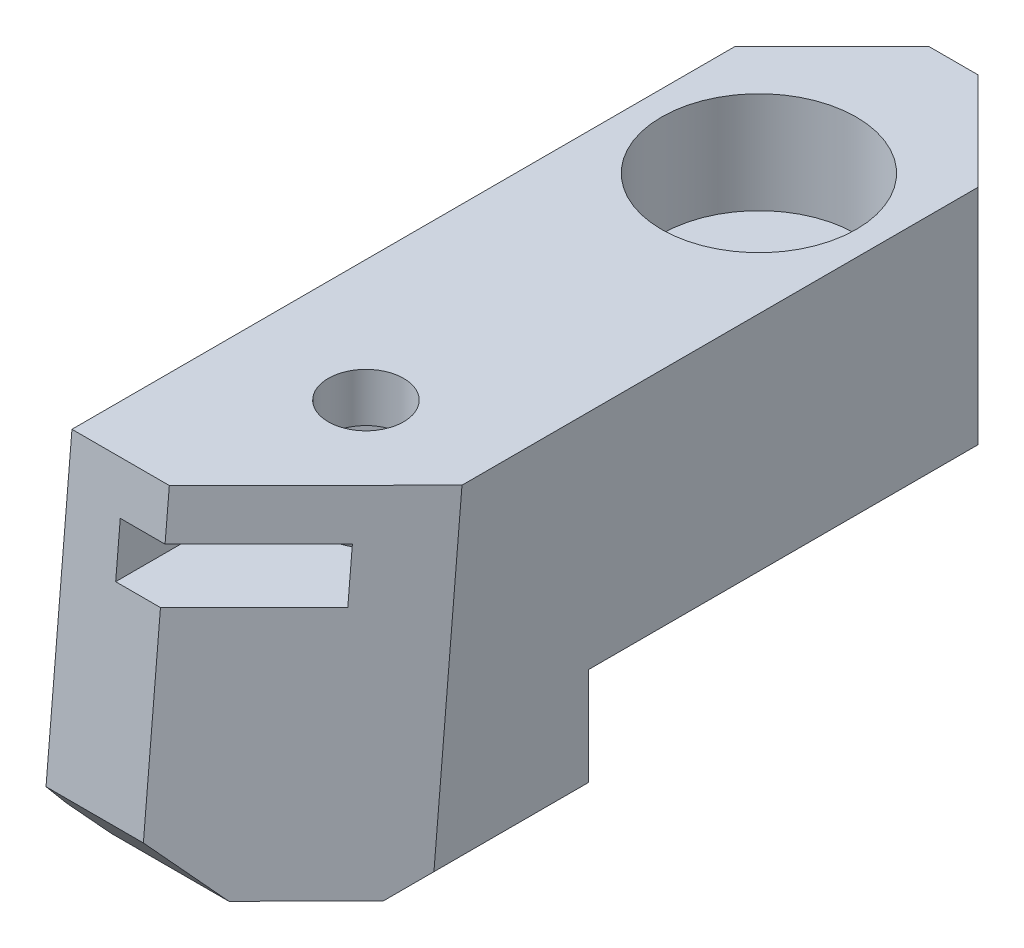
ISO-10303-21;
HEADER;
FILE_DESCRIPTION(('STEP AP214'),'2;1');
FILE_NAME('part.step','',(''),(''),'','','');
FILE_SCHEMA(('AUTOMOTIVE_DESIGN { 1 0 10303 214 1 1 1 1 }'));
ENDSEC;
DATA;
#1=APPLICATION_CONTEXT('core data for automotive mechanical design processes');
#2=APPLICATION_PROTOCOL_DEFINITION('international standard','automotive_design',2000,#1);
#3=PRODUCT_CONTEXT('',#1,'mechanical');
#4=PRODUCT('Part','Part','',(#3));
#5=PRODUCT_RELATED_PRODUCT_CATEGORY('part','',(#4));
#6=PRODUCT_DEFINITION_FORMATION('','',#4);
#7=PRODUCT_DEFINITION_CONTEXT('part definition',#1,'design');
#8=PRODUCT_DEFINITION('design','',#6,#7);
#9=PRODUCT_DEFINITION_SHAPE('','',#8);
#10=(LENGTH_UNIT() NAMED_UNIT(*) SI_UNIT(.MILLI.,.METRE.));
#11=(NAMED_UNIT(*) PLANE_ANGLE_UNIT() SI_UNIT($,.RADIAN.));
#12=(NAMED_UNIT(*) SI_UNIT($,.STERADIAN.) SOLID_ANGLE_UNIT());
#13=UNCERTAINTY_MEASURE_WITH_UNIT(LENGTH_MEASURE(1.E-05),#10,'distance_accuracy_value','');
#14=(GEOMETRIC_REPRESENTATION_CONTEXT(3) GLOBAL_UNCERTAINTY_ASSIGNED_CONTEXT((#13)) GLOBAL_UNIT_ASSIGNED_CONTEXT((#10,
#11,#12)) REPRESENTATION_CONTEXT('',''));
#15=CARTESIAN_POINT('',(0.,0.,0.));
#16=DIRECTION('',(0.,0.,1.));
#17=DIRECTION('',(1.,0.,0.));
#18=AXIS2_PLACEMENT_3D('',#15,#16,#17);
#19=CARTESIAN_POINT('',(7.9375,4.7625,-12.7));
#20=DIRECTION('',(0.,-1.,0.));
#21=DIRECTION('',(0.,0.,-1.));
#22=AXIS2_PLACEMENT_3D('',#19,#20,#21);
#23=PLANE('',#22);
#24=CARTESIAN_POINT('',(0.,4.7625,0.));
#25=DIRECTION('',(0.,-1.,0.));
#26=DIRECTION('',(0.,0.,-1.));
#27=AXIS2_PLACEMENT_3D('',#24,#25,#26);
#28=CIRCLE('',#27,2.45744999999999);
#29=CARTESIAN_POINT('',(0.,4.7625,-2.45744999999999));
#30=VERTEX_POINT('',#29);
#31=EDGE_CURVE('E269',#30,#30,#28,.T.);
#32=ORIENTED_EDGE('',*,*,#31,.T.);
#33=EDGE_LOOP('',(#32));
#34=FACE_BOUND('',#33,.T.);
#35=CARTESIAN_POINT('',(0.,4.7625,0.));
#36=DIRECTION('',(0.,1.,0.));
#37=DIRECTION('',(0.,0.,1.));
#38=AXIS2_PLACEMENT_3D('',#35,#36,#37);
#39=CIRCLE('',#38,6.35);
#40=CARTESIAN_POINT('',(0.,4.7625,6.35));
#41=VERTEX_POINT('',#40);
#42=EDGE_CURVE('E442',#41,#41,#39,.T.);
#43=ORIENTED_EDGE('',*,*,#42,.T.);
#44=EDGE_LOOP('',(#43));
#45=FACE_BOUND('',#44,.T.);
#46=ADVANCED_FACE('F35',(#34,#45),#23,.F.);
#47=CARTESIAN_POINT('',(0.,4.76249999999999,25.6261388396072));
#48=DIRECTION('',(0.,-1.,0.));
#49=DIRECTION('',(0.,0.,-1.));
#50=AXIS2_PLACEMENT_3D('',#47,#48,#49);
#51=CIRCLE('',#50,2.45744999999999);
#52=CARTESIAN_POINT('',(0.,4.76249999999999,23.1686888396072));
#53=VERTEX_POINT('',#52);
#54=EDGE_CURVE('E220',#53,#53,#51,.T.);
#55=ORIENTED_EDGE('',*,*,#54,.T.);
#56=EDGE_LOOP('',(#55));
#57=FACE_BOUND('',#56,.T.);
#58=DIRECTION('',(-1.,0.,0.));
#59=VECTOR('',#58,1.);
#60=CARTESIAN_POINT('',(7.9375,4.7625,37.4380337609568));
#61=LINE('',#60,#59);
#62=CARTESIAN_POINT('',(-1.58750000000001,4.7625,37.4380337609568));
#63=VERTEX_POINT('',#62);
#64=CARTESIAN_POINT('',(-4.5085,4.76250000000003,37.4380337609568));
#65=VERTEX_POINT('',#64);
#66=EDGE_CURVE('E219',#63,#65,#61,.T.);
#67=ORIENTED_EDGE('',*,*,#66,.F.);
#68=DIRECTION('',(-0.705757556807953,0.,0.708453436019947));
#69=VECTOR('',#68,1.);
#70=CARTESIAN_POINT('',(-1.58750000000001,4.7625,37.4380337609568));
#71=LINE('',#70,#69);
#72=CARTESIAN_POINT('',(4.5085,4.76249999999999,31.3187480312926));
#73=VERTEX_POINT('',#72);
#74=EDGE_CURVE('E390',#63,#73,#71,.F.);
#75=ORIENTED_EDGE('',*,*,#74,.T.);
#76=DIRECTION('',(0.,0.,1.));
#77=VECTOR('',#76,1.);
#78=CARTESIAN_POINT('',(4.5085,4.76249999999999,37.4380337609568));
#79=LINE('',#78,#77);
#80=CARTESIAN_POINT('',(4.5085,4.7625,23.0231551509658));
#81=VERTEX_POINT('',#80);
#82=EDGE_CURVE('E240',#81,#73,#79,.T.);
#83=ORIENTED_EDGE('',*,*,#82,.F.);
#84=DIRECTION('',(0.866025403784439,0.,0.5));
#85=VECTOR('',#84,1.);
#86=CARTESIAN_POINT('',(4.5085,4.7625,23.0231551509658));
#87=LINE('',#86,#85);
#88=CARTESIAN_POINT('',(0.,4.7625,20.4201714623243));
#89=VERTEX_POINT('',#88);
#90=EDGE_CURVE('E255',#89,#81,#87,.T.);
#91=ORIENTED_EDGE('',*,*,#90,.F.);
#92=DIRECTION('',(0.866025403784438,0.,-0.5));
#93=VECTOR('',#92,1.);
#94=CARTESIAN_POINT('',(0.,4.7625,20.4201714623243));
#95=LINE('',#94,#93);
#96=CARTESIAN_POINT('',(-4.5085,4.7625,23.0231551509658));
#97=VERTEX_POINT('',#96);
#98=EDGE_CURVE('E252',#97,#89,#95,.T.);
#99=ORIENTED_EDGE('',*,*,#98,.F.);
#100=DIRECTION('',(0.,0.,-1.));
#101=VECTOR('',#100,1.);
#102=CARTESIAN_POINT('',(-4.5085,4.7625,23.0231551509658));
#103=LINE('',#102,#101);
#104=EDGE_CURVE('E230',#65,#97,#103,.T.);
#105=ORIENTED_EDGE('',*,*,#104,.F.);
#106=EDGE_LOOP('',(#67,#75,#83,#91,#99,#105));
#107=FACE_BOUND('',#106,.T.);
#108=ADVANCED_FACE('F417',(#57,#107),#23,.F.);
#109=CARTESIAN_POINT('',(7.9375,-4.7625,-12.7));
#110=DIRECTION('',(0.,1.,0.));
#111=DIRECTION('',(0.,0.,1.));
#112=AXIS2_PLACEMENT_3D('',#109,#110,#111);
#113=PLANE('',#112);
#114=CARTESIAN_POINT('',(0.,-4.7625,0.));
#115=DIRECTION('',(0.,1.,0.));
#116=DIRECTION('',(0.,0.,1.));
#117=AXIS2_PLACEMENT_3D('',#114,#115,#116);
#118=CIRCLE('',#117,2.45744999999999);
#119=CARTESIAN_POINT('',(0.,-4.7625,2.45744999999999));
#120=VERTEX_POINT('',#119);
#121=EDGE_CURVE('E272',#120,#120,#118,.T.);
#122=ORIENTED_EDGE('',*,*,#121,.T.);
#123=EDGE_LOOP('',(#122));
#124=FACE_BOUND('',#123,.T.);
#125=DIRECTION('',(-0.707106781186549,0.,0.707106781186546));
#126=VECTOR('',#125,1.);
#127=CARTESIAN_POINT('',(15.875,-4.7625,-4.76249999999995));
#128=LINE('',#127,#126);
#129=CARTESIAN_POINT('',(-1.58749999999998,-4.7625,12.7));
#130=VERTEX_POINT('',#129);
#131=CARTESIAN_POINT('',(-6.35000000000001,-4.7625,17.4625));
#132=VERTEX_POINT('',#131);
#133=EDGE_CURVE('E307',#130,#132,#128,.T.);
#134=ORIENTED_EDGE('',*,*,#133,.T.);
#135=DIRECTION('',(0.,0.,-1.));
#136=VECTOR('',#135,1.);
#137=CARTESIAN_POINT('',(-6.35000000000001,-4.7625,-12.7));
#138=LINE('',#137,#136);
#139=CARTESIAN_POINT('',(-6.35000000000001,-4.7625,-5.6924359697327));
#140=VERTEX_POINT('',#139);
#141=EDGE_CURVE('E323',#132,#140,#138,.T.);
#142=ORIENTED_EDGE('',*,*,#141,.T.);
#143=DIRECTION('',(0.707106781186546,0.,-0.707106781186549));
#144=VECTOR('',#143,1.);
#145=CARTESIAN_POINT('',(-0.464967984866366,-4.7625,-11.5774679848664));
#146=LINE('',#145,#144);
#147=CARTESIAN_POINT('',(-0.92993596973272,-4.7625,-11.1125));
#148=VERTEX_POINT('',#147);
#149=EDGE_CURVE('E321',#140,#148,#146,.T.);
#150=ORIENTED_EDGE('',*,*,#149,.T.);
#151=DIRECTION('',(1.,0.,0.));
#152=VECTOR('',#151,1.);
#153=CARTESIAN_POINT('',(7.9375,-4.7625,-11.1125));
#154=LINE('',#153,#152);
#155=CARTESIAN_POINT('',(0.929935969732696,-4.7625,-11.1125));
#156=VERTEX_POINT('',#155);
#157=EDGE_CURVE('E319',#148,#156,#154,.T.);
#158=ORIENTED_EDGE('',*,*,#157,.T.);
#159=DIRECTION('',(0.707106781186549,0.,0.707106781186546));
#160=VECTOR('',#159,1.);
#161=CARTESIAN_POINT('',(6.81496798486636,-4.7625,-5.22746798486636));
#162=LINE('',#161,#160);
#163=CARTESIAN_POINT('',(6.35000000000001,-4.7625,-5.69243596973271));
#164=VERTEX_POINT('',#163);
#165=EDGE_CURVE('E317',#156,#164,#162,.T.);
#166=ORIENTED_EDGE('',*,*,#165,.T.);
#167=DIRECTION('',(0.,0.,1.));
#168=VECTOR('',#167,1.);
#169=CARTESIAN_POINT('',(6.35000000000001,-4.7625,19.05));
#170=LINE('',#169,#168);
#171=CARTESIAN_POINT('',(6.35000000000001,-4.7625,17.4625));
#172=VERTEX_POINT('',#171);
#173=EDGE_CURVE('E315',#164,#172,#170,.T.);
#174=ORIENTED_EDGE('',*,*,#173,.T.);
#175=DIRECTION('',(0.707106781186546,0.,0.707106781186549));
#176=VECTOR('',#175,1.);
#177=CARTESIAN_POINT('',(-7.93750000000001,-4.7625,3.17499999999996));
#178=LINE('',#177,#176);
#179=CARTESIAN_POINT('',(1.58750000000001,-4.7625,12.7));
#180=VERTEX_POINT('',#179);
#181=EDGE_CURVE('E305',#172,#180,#178,.F.);
#182=ORIENTED_EDGE('',*,*,#181,.T.);
#183=DIRECTION('',(-1.,0.,0.));
#184=VECTOR('',#183,1.);
#185=CARTESIAN_POINT('',(7.9375,-4.7625,12.7));
#186=LINE('',#185,#184);
#187=EDGE_CURVE('E282',#180,#130,#186,.T.);
#188=ORIENTED_EDGE('',*,*,#187,.T.);
#189=EDGE_LOOP('',(#134,#142,#150,#158,#166,#174,#182,#188));
#190=FACE_BOUND('',#189,.T.);
#191=ADVANCED_FACE('F468',(#124,#190),#113,.F.);
#192=CARTESIAN_POINT('',(7.9375,-4.7625,-12.7));
#193=DIRECTION('',(0.,0.,1.));
#194=DIRECTION('',(1.,0.,0.));
#195=AXIS2_PLACEMENT_3D('',#192,#193,#194);
#196=PLANE('',#195);
#197=DIRECTION('',(0.,-1.,0.));
#198=VECTOR('',#197,1.);
#199=CARTESIAN_POINT('',(1.58749999999998,-4.7625,-12.7));
#200=LINE('',#199,#198);
#201=CARTESIAN_POINT('',(1.58749999999998,11.3665,-12.7));
#202=VERTEX_POINT('',#201);
#203=CARTESIAN_POINT('',(1.58749999999998,-3.17500000000001,-12.7));
#204=VERTEX_POINT('',#203);
#205=EDGE_CURVE('E297',#202,#204,#200,.T.);
#206=ORIENTED_EDGE('',*,*,#205,.T.);
#207=DIRECTION('',(-1.,0.,0.));
#208=VECTOR('',#207,1.);
#209=CARTESIAN_POINT('',(7.9375,-3.17500000000001,-12.7));
#210=LINE('',#209,#208);
#211=CARTESIAN_POINT('',(-1.58750000000001,-3.17500000000001,-12.7));
#212=VERTEX_POINT('',#211);
#213=EDGE_CURVE('E333',#204,#212,#210,.T.);
#214=ORIENTED_EDGE('',*,*,#213,.T.);
#215=DIRECTION('',(0.,1.,0.));
#216=VECTOR('',#215,1.);
#217=CARTESIAN_POINT('',(-1.58750000000001,-4.7625,-12.7));
#218=LINE('',#217,#216);
#219=CARTESIAN_POINT('',(-1.58750000000001,11.3665,-12.7));
#220=VERTEX_POINT('',#219);
#221=EDGE_CURVE('E295',#212,#220,#218,.T.);
#222=ORIENTED_EDGE('',*,*,#221,.T.);
#223=DIRECTION('',(-1.,0.,0.));
#224=VECTOR('',#223,1.);
#225=CARTESIAN_POINT('',(1.58749999999998,11.3665,-12.7));
#226=LINE('',#225,#224);
#227=EDGE_CURVE('E437',#202,#220,#226,.T.);
#228=ORIENTED_EDGE('',*,*,#227,.F.);
#229=EDGE_LOOP('',(#206,#214,#222,#228));
#230=FACE_BOUND('',#229,.T.);
#231=ADVANCED_FACE('F473',(#230),#196,.F.);
#232=CARTESIAN_POINT('',(7.9375,0.,0.));
#233=DIRECTION('',(1.,0.,0.));
#234=DIRECTION('',(0.,0.,-1.));
#235=AXIS2_PLACEMENT_3D('',#232,#233,#234);
#236=PLANE('',#235);
#237=DIRECTION('',(0.,0.,-1.));
#238=VECTOR('',#237,1.);
#239=CARTESIAN_POINT('',(7.9375,11.3665,16.9911714623244));
#240=LINE('',#239,#238);
#241=CARTESIAN_POINT('',(7.9375,11.3665,27.2988746744316));
#242=VERTEX_POINT('',#241);
#243=CARTESIAN_POINT('',(7.9375,11.3665,-6.35));
#244=VERTEX_POINT('',#243);
#245=EDGE_CURVE('E227',#242,#244,#240,.T.);
#246=ORIENTED_EDGE('',*,*,#245,.F.);
#247=DIRECTION('',(0.,-0.996194698091751,0.0871557427476012));
#248=VECTOR('',#247,1.);
#249=CARTESIAN_POINT('',(7.9375,2.4565412574782,28.0783950568855));
#250=LINE('',#249,#248);
#251=CARTESIAN_POINT('',(7.9375,-9.5487844301668,29.1287249564903));
#252=VERTEX_POINT('',#251);
#253=EDGE_CURVE('E398',#242,#252,#250,.T.);
#254=ORIENTED_EDGE('',*,*,#253,.T.);
#255=DIRECTION('',(0.,0.,-1.));
#256=VECTOR('',#255,1.);
#257=CARTESIAN_POINT('',(7.9375,-9.54878443016482,-6.47897790496993E-13));
#258=LINE('',#257,#256);
#259=CARTESIAN_POINT('',(7.9375,-9.54878443016619,19.05));
#260=VERTEX_POINT('',#259);
#261=EDGE_CURVE('E337',#252,#260,#258,.T.);
#262=ORIENTED_EDGE('',*,*,#261,.T.);
#263=DIRECTION('',(0.,1.,0.));
#264=VECTOR('',#263,1.);
#265=CARTESIAN_POINT('',(7.9375,0.,19.05));
#266=LINE('',#265,#264);
#267=CARTESIAN_POINT('',(7.9375,-3.17500000000001,19.05));
#268=VERTEX_POINT('',#267);
#269=EDGE_CURVE('E293',#260,#268,#266,.T.);
#270=ORIENTED_EDGE('',*,*,#269,.T.);
#271=DIRECTION('',(0.,0.,-1.));
#272=VECTOR('',#271,1.);
#273=CARTESIAN_POINT('',(7.9375,-3.17500000000001,-6.35));
#274=LINE('',#273,#272);
#275=CARTESIAN_POINT('',(7.9375,-3.17500000000001,-6.35));
#276=VERTEX_POINT('',#275);
#277=EDGE_CURVE('E339',#268,#276,#274,.T.);
#278=ORIENTED_EDGE('',*,*,#277,.T.);
#279=DIRECTION('',(0.,1.,0.));
#280=VECTOR('',#279,1.);
#281=CARTESIAN_POINT('',(7.9375,4.7625,-6.35));
#282=LINE('',#281,#280);
#283=EDGE_CURVE('E290',#276,#244,#282,.T.);
#284=ORIENTED_EDGE('',*,*,#283,.T.);
#285=EDGE_LOOP('',(#246,#254,#262,#270,#278,#284));
#286=FACE_BOUND('',#285,.T.);
#287=ADVANCED_FACE('F403',(#286),#236,.T.);
#288=CARTESIAN_POINT('',(-7.9375,0.,0.));
#289=DIRECTION('',(1.,0.,0.));
#290=DIRECTION('',(0.,0.,-1.));
#291=AXIS2_PLACEMENT_3D('',#288,#289,#290);
#292=PLANE('',#291);
#293=DIRECTION('',(0.,0.996194698091751,-0.0871557427476012));
#294=VECTOR('',#293,1.);
#295=CARTESIAN_POINT('',(-7.9375,4.7625,37.4380337609568));
#296=LINE('',#295,#294);
#297=CARTESIAN_POINT('',(-7.9375,-7.97336626372615,38.5522776792144));
#298=VERTEX_POINT('',#297);
#299=CARTESIAN_POINT('',(-7.9375,11.3665,36.860258627032));
#300=VERTEX_POINT('',#299);
#301=EDGE_CURVE('E201',#298,#300,#296,.T.);
#302=ORIENTED_EDGE('',*,*,#301,.T.);
#303=DIRECTION('',(0.,0.,1.));
#304=VECTOR('',#303,1.);
#305=CARTESIAN_POINT('',(-7.9375,11.3665,16.9911714623244));
#306=LINE('',#305,#304);
#307=CARTESIAN_POINT('',(-7.9375,11.3665,-6.34999999999999));
#308=VERTEX_POINT('',#307);
#309=EDGE_CURVE('E215',#308,#300,#306,.T.);
#310=ORIENTED_EDGE('',*,*,#309,.F.);
#311=DIRECTION('',(0.,-1.,0.));
#312=VECTOR('',#311,1.);
#313=CARTESIAN_POINT('',(-7.9375,0.,-6.34999999999999));
#314=LINE('',#313,#312);
#315=CARTESIAN_POINT('',(-7.9375,-3.17500000000001,-6.34999999999999));
#316=VERTEX_POINT('',#315);
#317=EDGE_CURVE('E303',#308,#316,#314,.T.);
#318=ORIENTED_EDGE('',*,*,#317,.T.);
#319=DIRECTION('',(0.,0.,1.));
#320=VECTOR('',#319,1.);
#321=CARTESIAN_POINT('',(-7.9375,-3.17500000000001,0.));
#322=LINE('',#321,#320);
#323=CARTESIAN_POINT('',(-7.9375,-3.17500000000001,19.05));
#324=VERTEX_POINT('',#323);
#325=EDGE_CURVE('E328',#316,#324,#322,.T.);
#326=ORIENTED_EDGE('',*,*,#325,.T.);
#327=DIRECTION('',(0.,-1.,0.));
#328=VECTOR('',#327,1.);
#329=CARTESIAN_POINT('',(-7.9375,-11.1362844301657,19.05));
#330=LINE('',#329,#328);
#331=CARTESIAN_POINT('',(-7.9375,-9.54878443016611,19.05));
#332=VERTEX_POINT('',#331);
#333=EDGE_CURVE('E300',#324,#332,#330,.T.);
#334=ORIENTED_EDGE('',*,*,#333,.T.);
#335=DIRECTION('',(0.,0.,1.));
#336=VECTOR('',#335,1.);
#337=CARTESIAN_POINT('',(-7.9375,-9.54878443016726,35.8982742123096));
#338=LINE('',#337,#336);
#339=CARTESIAN_POINT('',(-7.9375,-9.54878443016735,37.2303448768035));
#340=VERTEX_POINT('',#339);
#341=EDGE_CURVE('E326',#332,#340,#338,.T.);
#342=ORIENTED_EDGE('',*,*,#341,.T.);
#343=DIRECTION('',(0.,-0.766044443118942,-0.642787609686583));
#344=VECTOR('',#343,1.);
#345=CARTESIAN_POINT('',(-7.9375,-11.1362844301673,35.8982742123094));
#346=LINE('',#345,#344);
#347=EDGE_CURVE('E218',#340,#298,#346,.F.);
#348=ORIENTED_EDGE('',*,*,#347,.T.);
#349=EDGE_LOOP('',(#302,#310,#318,#326,#334,#342,#348));
#350=FACE_BOUND('',#349,.T.);
#351=ADVANCED_FACE('F213',(#350),#292,.F.);
#352=CARTESIAN_POINT('',(7.9375,-11.1362844301657,12.7));
#353=DIRECTION('',(0.,0.,-1.));
#354=DIRECTION('',(-1.,0.,0.));
#355=AXIS2_PLACEMENT_3D('',#352,#353,#354);
#356=PLANE('',#355);
#357=DIRECTION('',(0.,-1.,0.));
#358=VECTOR('',#357,1.);
#359=CARTESIAN_POINT('',(1.58750000000001,-11.1362844301657,12.7));
#360=LINE('',#359,#358);
#361=CARTESIAN_POINT('',(1.58750000000001,-9.54878443016579,12.7));
#362=VERTEX_POINT('',#361);
#363=EDGE_CURVE('E287',#180,#362,#360,.T.);
#364=ORIENTED_EDGE('',*,*,#363,.T.);
#365=DIRECTION('',(-1.,0.,0.));
#366=VECTOR('',#365,1.);
#367=CARTESIAN_POINT('',(7.9375,-9.54878443016579,12.7));
#368=LINE('',#367,#366);
#369=CARTESIAN_POINT('',(-1.58749999999999,-9.54878443016576,12.7));
#370=VERTEX_POINT('',#369);
#371=EDGE_CURVE('E356',#362,#370,#368,.T.);
#372=ORIENTED_EDGE('',*,*,#371,.T.);
#373=DIRECTION('',(0.,1.,0.));
#374=VECTOR('',#373,1.);
#375=CARTESIAN_POINT('',(-1.58749999999999,-4.7625,12.7));
#376=LINE('',#375,#374);
#377=EDGE_CURVE('E285',#370,#130,#376,.T.);
#378=ORIENTED_EDGE('',*,*,#377,.T.);
#379=ORIENTED_EDGE('',*,*,#187,.F.);
#380=EDGE_LOOP('',(#364,#372,#378,#379));
#381=FACE_BOUND('',#380,.T.);
#382=ADVANCED_FACE('F555',(#381),#356,.T.);
#383=CARTESIAN_POINT('',(7.9375,4.7625,37.4380337609568));
#384=DIRECTION('',(0.,0.0871557427476012,0.996194698091751));
#385=DIRECTION('',(0.,-0.996194698091751,0.0871557427476012));
#386=AXIS2_PLACEMENT_3D('',#383,#384,#385);
#387=PLANE('',#386);
#388=DIRECTION('',(1.,0.,0.));
#389=VECTOR('',#388,1.);
#390=CARTESIAN_POINT('',(7.9375,-7.97336626372614,38.5522776792144));
#391=LINE('',#390,#389);
#392=CARTESIAN_POINT('',(-1.58750000000001,-7.97336626372614,38.5522776792144));
#393=VERTEX_POINT('',#392);
#394=EDGE_CURVE('E313',#298,#393,#391,.T.);
#395=ORIENTED_EDGE('',*,*,#394,.T.);
#396=DIRECTION('',(0.,0.996194698091751,-0.0871557427476012));
#397=VECTOR('',#396,1.);
#398=CARTESIAN_POINT('',(-1.58750000000001,4.7625,37.4380337609568));
#399=LINE('',#398,#397);
#400=EDGE_CURVE('E387',#393,#63,#399,.T.);
#401=ORIENTED_EDGE('',*,*,#400,.T.);
#402=ORIENTED_EDGE('',*,*,#66,.T.);
#403=DIRECTION('',(0.,-0.996194698091751,0.0871557427476022));
#404=VECTOR('',#403,1.);
#405=CARTESIAN_POINT('',(-4.5085,9.41701159349614,37.0308167622762));
#406=LINE('',#405,#404);
#407=CARTESIAN_POINT('',(-4.5085,8.19149999999999,37.1380351337266));
#408=VERTEX_POINT('',#407);
#409=EDGE_CURVE('E423',#408,#65,#406,.T.);
#410=ORIENTED_EDGE('',*,*,#409,.F.);
#411=DIRECTION('',(-1.,0.,0.));
#412=VECTOR('',#411,1.);
#413=CARTESIAN_POINT('',(0.,8.19149999999999,37.1380351337266));
#414=LINE('',#413,#412);
#415=CARTESIAN_POINT('',(-1.58750000000001,8.19149999999999,37.1380351337266));
#416=VERTEX_POINT('',#415);
#417=EDGE_CURVE('E209',#416,#408,#414,.T.);
#418=ORIENTED_EDGE('',*,*,#417,.F.);
#419=DIRECTION('',(0.,0.996194698091751,-0.0871557427476012));
#420=VECTOR('',#419,1.);
#421=CARTESIAN_POINT('',(-1.58750000000001,4.7625,37.4380337609568));
#422=LINE('',#421,#420);
#423=CARTESIAN_POINT('',(-1.58750000000001,11.3665,36.860258627032));
#424=VERTEX_POINT('',#423);
#425=EDGE_CURVE('E205',#416,#424,#422,.T.);
#426=ORIENTED_EDGE('',*,*,#425,.T.);
#427=DIRECTION('',(-1.,0.,0.));
#428=VECTOR('',#427,1.);
#429=CARTESIAN_POINT('',(7.9375,11.3665,36.860258627032));
#430=LINE('',#429,#428);
#431=EDGE_CURVE('E197',#424,#300,#430,.T.);
#432=ORIENTED_EDGE('',*,*,#431,.T.);
#433=ORIENTED_EDGE('',*,*,#301,.F.);
#434=EDGE_LOOP('',(#395,#401,#402,#410,#418,#426,#432,#433));
#435=FACE_BOUND('',#434,.T.);
#436=ADVANCED_FACE('F200',(#435),#387,.T.);
#437=CARTESIAN_POINT('',(7.9375,-11.1362844301675,38.828997162438));
#438=DIRECTION('',(0.,-1.,0.));
#439=DIRECTION('',(0.,0.,-1.));
#440=AXIS2_PLACEMENT_3D('',#437,#438,#439);
#441=PLANE('',#440);
#442=CARTESIAN_POINT('',(0.,-11.1362844301648,25.6261388396072));
#443=DIRECTION('',(0.,-1.,0.));
#444=DIRECTION('',(0.,0.,-1.));
#445=AXIS2_PLACEMENT_3D('',#442,#443,#444);
#446=CIRCLE('',#445,2.45744999999999);
#447=CARTESIAN_POINT('',(0.,-11.1362844301648,23.1686888396072));
#448=VERTEX_POINT('',#447);
#449=EDGE_CURVE('E276',#448,#448,#446,.T.);
#450=ORIENTED_EDGE('',*,*,#449,.F.);
#451=EDGE_LOOP('',(#450));
#452=FACE_BOUND('',#451,.T.);
#453=DIRECTION('',(0.,0.,1.));
#454=VECTOR('',#453,1.);
#455=CARTESIAN_POINT('',(6.35,-11.1362844301675,38.828997162438));
#456=LINE('',#455,#454);
#457=CARTESIAN_POINT('',(6.35,-11.1362844301662,19.7075640302672));
#458=VERTEX_POINT('',#457);
#459=CARTESIAN_POINT('',(6.35,-11.1362844301669,30.8611772019377));
#460=VERTEX_POINT('',#459);
#461=EDGE_CURVE('E349',#458,#460,#456,.T.);
#462=ORIENTED_EDGE('',*,*,#461,.T.);
#463=DIRECTION('',(0.70575755680795,0.,-0.708453436019949));
#464=VECTOR('',#463,1.);
#465=CARTESIAN_POINT('',(3.15684276864429,-11.1362844301671,34.0665317751675));
#466=LINE('',#465,#464);
#467=CARTESIAN_POINT('',(1.33207066449388,-11.1362844301673,35.8982742123094));
#468=VERTEX_POINT('',#467);
#469=EDGE_CURVE('E44',#460,#468,#466,.F.);
#470=ORIENTED_EDGE('',*,*,#469,.T.);
#471=DIRECTION('',(-1.,0.,0.));
#472=VECTOR('',#471,1.);
#473=CARTESIAN_POINT('',(7.9375,-11.1362844301673,35.8982742123094));
#474=LINE('',#473,#472);
#475=CARTESIAN_POINT('',(-6.35,-11.1362844301673,35.8982742123094));
#476=VERTEX_POINT('',#475);
#477=EDGE_CURVE('E310',#468,#476,#474,.T.);
#478=ORIENTED_EDGE('',*,*,#477,.T.);
#479=DIRECTION('',(0.,0.,-1.));
#480=VECTOR('',#479,1.);
#481=CARTESIAN_POINT('',(-6.35,-11.1362844301661,19.05));
#482=LINE('',#481,#480);
#483=CARTESIAN_POINT('',(-6.35,-11.1362844301662,19.7075640302672));
#484=VERTEX_POINT('',#483);
#485=EDGE_CURVE('E341',#476,#484,#482,.T.);
#486=ORIENTED_EDGE('',*,*,#485,.T.);
#487=DIRECTION('',(0.707106781186549,0.,-0.707106781186546));
#488=VECTOR('',#487,1.);
#489=CARTESIAN_POINT('',(-8.76696656608541,-11.1362844301663,22.1245305963526));
#490=LINE('',#489,#488);
#491=CARTESIAN_POINT('',(-0.929935969732704,-11.1362844301658,14.2874999999999));
#492=VERTEX_POINT('',#491);
#493=EDGE_CURVE('E343',#484,#492,#490,.T.);
#494=ORIENTED_EDGE('',*,*,#493,.T.);
#495=DIRECTION('',(1.,0.,0.));
#496=VECTOR('',#495,1.);
#497=CARTESIAN_POINT('',(7.9375,-11.1362844301658,14.2874999999999));
#498=LINE('',#497,#496);
#499=CARTESIAN_POINT('',(0.929935969732715,-11.1362844301658,14.2874999999999));
#500=VERTEX_POINT('',#499);
#501=EDGE_CURVE('E345',#492,#500,#498,.T.);
#502=ORIENTED_EDGE('',*,*,#501,.T.);
#503=DIRECTION('',(0.707106781186546,0.,0.707106781186549));
#504=VECTOR('',#503,1.);
#505=CARTESIAN_POINT('',(16.7044665660854,-11.1362844301669,30.0620305963526));
#506=LINE('',#505,#504);
#507=EDGE_CURVE('E347',#500,#458,#506,.T.);
#508=ORIENTED_EDGE('',*,*,#507,.T.);
#509=EDGE_LOOP('',(#462,#470,#478,#486,#494,#502,#508));
#510=FACE_BOUND('',#509,.T.);
#511=ADVANCED_FACE('F484',(#452,#510),#441,.T.);
#512=CARTESIAN_POINT('',(1.58750000000001,-11.1362844301657,12.7));
#513=DIRECTION('',(-0.707106781186549,0.,0.707106781186546));
#514=DIRECTION('',(0.,-1.,0.));
#515=AXIS2_PLACEMENT_3D('',#512,#513,#514);
#516=PLANE('',#515);
#517=ORIENTED_EDGE('',*,*,#269,.F.);
#518=DIRECTION('',(0.707106781186546,0.,0.707106781186549));
#519=VECTOR('',#518,1.);
#520=CARTESIAN_POINT('',(1.58750000000006,-9.54878443016576,12.7000000000001));
#521=LINE('',#520,#519);
#522=EDGE_CURVE('E354',#260,#362,#521,.F.);
#523=ORIENTED_EDGE('',*,*,#522,.T.);
#524=ORIENTED_EDGE('',*,*,#363,.F.);
#525=ORIENTED_EDGE('',*,*,#181,.F.);
#526=DIRECTION('',(-0.577350269189625,-0.577350269189625,-0.577350269189627));
#527=VECTOR('',#526,1.);
#528=CARTESIAN_POINT('',(1.58749999999999,-9.52500000000002,12.7));
#529=LINE('',#528,#527);
#530=EDGE_CURVE('E362',#172,#268,#529,.F.);
#531=ORIENTED_EDGE('',*,*,#530,.T.);
#532=EDGE_LOOP('',(#517,#523,#524,#525,#531));
#533=FACE_BOUND('',#532,.T.);
#534=ADVANCED_FACE('F480',(#533),#516,.F.);
#535=CARTESIAN_POINT('',(7.9375,0.,-6.35));
#536=DIRECTION('',(0.707106781186546,0.,-0.707106781186549));
#537=DIRECTION('',(0.,-1.,0.));
#538=AXIS2_PLACEMENT_3D('',#535,#536,#537);
#539=PLANE('',#538);
#540=ORIENTED_EDGE('',*,*,#283,.F.);
#541=DIRECTION('',(-0.707106781186549,0.,-0.707106781186546));
#542=VECTOR('',#541,1.);
#543=CARTESIAN_POINT('',(1.58749999999998,-3.17500000000001,-12.7));
#544=LINE('',#543,#542);
#545=EDGE_CURVE('E335',#276,#204,#544,.T.);
#546=ORIENTED_EDGE('',*,*,#545,.T.);
#547=ORIENTED_EDGE('',*,*,#205,.F.);
#548=DIRECTION('',(-0.707106781186549,0.,-0.707106781186546));
#549=VECTOR('',#548,1.);
#550=CARTESIAN_POINT('',(7.9375,11.3665,-6.35));
#551=LINE('',#550,#549);
#552=EDGE_CURVE('E439',#244,#202,#551,.T.);
#553=ORIENTED_EDGE('',*,*,#552,.F.);
#554=EDGE_LOOP('',(#540,#546,#547,#553));
#555=FACE_BOUND('',#554,.T.);
#556=ADVANCED_FACE('F483',(#555),#539,.T.);
#557=CARTESIAN_POINT('',(-1.58750000000001,-4.7625,-12.7));
#558=DIRECTION('',(0.707106781186549,0.,0.707106781186546));
#559=DIRECTION('',(0.,1.,0.));
#560=AXIS2_PLACEMENT_3D('',#557,#558,#559);
#561=PLANE('',#560);
#562=ORIENTED_EDGE('',*,*,#221,.F.);
#563=DIRECTION('',(0.707106781186546,0.,-0.707106781186549));
#564=VECTOR('',#563,1.);
#565=CARTESIAN_POINT('',(-7.9375,-3.17500000000001,-6.34999999999999));
#566=LINE('',#565,#564);
#567=EDGE_CURVE('E331',#212,#316,#566,.F.);
#568=ORIENTED_EDGE('',*,*,#567,.T.);
#569=ORIENTED_EDGE('',*,*,#317,.F.);
#570=DIRECTION('',(-0.707106781186546,0.,0.707106781186549));
#571=VECTOR('',#570,1.);
#572=CARTESIAN_POINT('',(-1.58750000000001,11.3665,-12.7));
#573=LINE('',#572,#571);
#574=EDGE_CURVE('E226',#220,#308,#573,.T.);
#575=ORIENTED_EDGE('',*,*,#574,.F.);
#576=EDGE_LOOP('',(#562,#568,#569,#575));
#577=FACE_BOUND('',#576,.T.);
#578=ADVANCED_FACE('F488',(#577),#561,.F.);
#579=CARTESIAN_POINT('',(-7.9375,0.,19.05));
#580=DIRECTION('',(-0.707106781186546,0.,-0.707106781186549));
#581=DIRECTION('',(0.,1.,0.));
#582=AXIS2_PLACEMENT_3D('',#579,#580,#581);
#583=PLANE('',#582);
#584=ORIENTED_EDGE('',*,*,#377,.F.);
#585=DIRECTION('',(-0.707106781186549,0.,0.707106781186546));
#586=VECTOR('',#585,1.);
#587=CARTESIAN_POINT('',(-7.93749999999968,-9.54878443016619,19.0499999999997));
#588=LINE('',#587,#586);
#589=EDGE_CURVE('E358',#370,#332,#588,.T.);
#590=ORIENTED_EDGE('',*,*,#589,.T.);
#591=ORIENTED_EDGE('',*,*,#333,.F.);
#592=DIRECTION('',(-0.577350269189627,0.577350269189626,0.577350269189624));
#593=VECTOR('',#592,1.);
#594=CARTESIAN_POINT('',(3.70416666666665,-14.8166666666667,7.40833333333339));
#595=LINE('',#594,#593);
#596=EDGE_CURVE('E360',#324,#132,#595,.F.);
#597=ORIENTED_EDGE('',*,*,#596,.T.);
#598=ORIENTED_EDGE('',*,*,#133,.F.);
#599=EDGE_LOOP('',(#584,#590,#591,#597,#598));
#600=FACE_BOUND('',#599,.T.);
#601=ADVANCED_FACE('F492',(#600),#583,.T.);
#602=CARTESIAN_POINT('',(7.9375,-11.1362844301673,35.8982742123094));
#603=DIRECTION('',(0.,0.642787609686583,-0.766044443118942));
#604=DIRECTION('',(-1.,0.,0.));
#605=AXIS2_PLACEMENT_3D('',#602,#603,#604);
#606=PLANE('',#605);
#607=ORIENTED_EDGE('',*,*,#477,.F.);
#608=DIRECTION('',(-0.577350269189624,0.625472668645301,0.524833885571801));
#609=VECTOR('',#608,1.);
#610=CARTESIAN_POINT('',(3.53388044299591,-13.5216160243518,33.8967433513934));
#611=LINE('',#610,#609);
#612=EDGE_CURVE('E11',#468,#393,#611,.T.);
#613=ORIENTED_EDGE('',*,*,#612,.T.);
#614=ORIENTED_EDGE('',*,*,#394,.F.);
#615=ORIENTED_EDGE('',*,*,#347,.F.);
#616=DIRECTION('',(-0.608120402411346,0.608120402411312,0.51027360537477));
#617=VECTOR('',#616,1.);
#618=CARTESIAN_POINT('',(-1.06633356954405,-16.4199508606229,31.4647516592498));
#619=LINE('',#618,#617);
#620=EDGE_CURVE('E351',#340,#476,#619,.F.);
#621=ORIENTED_EDGE('',*,*,#620,.T.);
#622=EDGE_LOOP('',(#607,#613,#614,#615,#621));
#623=FACE_BOUND('',#622,.T.);
#624=ADVANCED_FACE('F411',(#623),#606,.F.);
#625=CARTESIAN_POINT('',(0.,-11.1362844301648,25.6261388396072));
#626=DIRECTION('',(0.,-1.,0.));
#627=DIRECTION('',(0.,0.,-1.));
#628=AXIS2_PLACEMENT_3D('',#625,#626,#627);
#629=CYLINDRICAL_SURFACE('',#628,2.45744999999999);
#630=ORIENTED_EDGE('',*,*,#54,.F.);
#631=EDGE_LOOP('',(#630));
#632=FACE_BOUND('',#631,.T.);
#633=ORIENTED_EDGE('',*,*,#449,.T.);
#634=EDGE_LOOP('',(#633));
#635=FACE_BOUND('',#634,.T.);
#636=ADVANCED_FACE('F499',(#632,#635),#629,.F.);
#637=CARTESIAN_POINT('',(0.,-11.1362844301648,0.));
#638=DIRECTION('',(0.,-1.,0.));
#639=DIRECTION('',(0.,0.,-1.));
#640=AXIS2_PLACEMENT_3D('',#637,#638,#639);
#641=CYLINDRICAL_SURFACE('',#640,2.45744999999999);
#642=ORIENTED_EDGE('',*,*,#31,.F.);
#643=EDGE_LOOP('',(#642));
#644=FACE_BOUND('',#643,.T.);
#645=ORIENTED_EDGE('',*,*,#121,.F.);
#646=EDGE_LOOP('',(#645));
#647=FACE_BOUND('',#646,.T.);
#648=ADVANCED_FACE('F520',(#644,#647),#641,.F.);
#649=CARTESIAN_POINT('',(7.9375,-3.17500000000001,0.));
#650=DIRECTION('',(0.707106781186548,-0.707106781186548,0.));
#651=DIRECTION('',(0.,0.,1.));
#652=AXIS2_PLACEMENT_3D('',#649,#650,#651);
#653=PLANE('',#652);
#654=ORIENTED_EDGE('',*,*,#530,.F.);
#655=ORIENTED_EDGE('',*,*,#173,.F.);
#656=DIRECTION('',(0.678598344545847,0.678598344545847,-0.281084637714821));
#657=VECTOR('',#656,1.);
#658=CARTESIAN_POINT('',(6.72627833157603,-4.38622166842398,-5.84829555789862));
#659=LINE('',#658,#657);
#660=EDGE_CURVE('E273',#276,#164,#659,.F.);
#661=ORIENTED_EDGE('',*,*,#660,.F.);
#662=ORIENTED_EDGE('',*,*,#277,.F.);
#663=EDGE_LOOP('',(#654,#655,#661,#662));
#664=FACE_BOUND('',#663,.T.);
#665=ADVANCED_FACE('F516',(#664),#653,.T.);
#666=CARTESIAN_POINT('',(3.63996798486636,-4.7625,-8.40246798486635));
#667=DIRECTION('',(0.499999999999999,-0.707106781186547,-0.500000000000001));
#668=DIRECTION('',(-0.707106781186549,0.,-0.707106781186546));
#669=AXIS2_PLACEMENT_3D('',#666,#667,#668);
#670=PLANE('',#669);
#671=ORIENTED_EDGE('',*,*,#660,.T.);
#672=ORIENTED_EDGE('',*,*,#165,.F.);
#673=DIRECTION('',(-0.281084637714819,-0.678598344545847,0.678598344545847));
#674=VECTOR('',#673,1.);
#675=CARTESIAN_POINT('',(0.627130552626702,-5.49353694473733,-10.3814630552627));
#676=LINE('',#675,#674);
#677=EDGE_CURVE('E371',#204,#156,#676,.T.);
#678=ORIENTED_EDGE('',*,*,#677,.F.);
#679=ORIENTED_EDGE('',*,*,#545,.F.);
#680=EDGE_LOOP('',(#671,#672,#678,#679));
#681=FACE_BOUND('',#680,.T.);
#682=ADVANCED_FACE('F512',(#681),#670,.T.);
#683=CARTESIAN_POINT('',(7.9375,-3.17500000000001,-12.7));
#684=DIRECTION('',(0.,0.707106781186548,0.707106781186548));
#685=DIRECTION('',(-1.,0.,0.));
#686=AXIS2_PLACEMENT_3D('',#683,#684,#685);
#687=PLANE('',#686);
#688=ORIENTED_EDGE('',*,*,#677,.T.);
#689=ORIENTED_EDGE('',*,*,#157,.F.);
#690=DIRECTION('',(-0.28108463771482,0.678598344545847,-0.678598344545847));
#691=VECTOR('',#690,1.);
#692=CARTESIAN_POINT('',(-0.834943336847941,-4.99183250263596,-10.883167497364));
#693=LINE('',#692,#691);
#694=EDGE_CURVE('E367',#212,#148,#693,.F.);
#695=ORIENTED_EDGE('',*,*,#694,.F.);
#696=ORIENTED_EDGE('',*,*,#213,.F.);
#697=EDGE_LOOP('',(#688,#689,#695,#696));
#698=FACE_BOUND('',#697,.T.);
#699=ADVANCED_FACE('F508',(#698),#687,.F.);
#700=CARTESIAN_POINT('',(4.29753201513362,-4.7625,-16.3399679848664));
#701=DIRECTION('',(0.500000000000001,0.707106781186547,0.499999999999999));
#702=DIRECTION('',(0.707106781186546,0.,-0.707106781186549));
#703=AXIS2_PLACEMENT_3D('',#700,#701,#702);
#704=PLANE('',#703);
#705=ORIENTED_EDGE('',*,*,#694,.T.);
#706=ORIENTED_EDGE('',*,*,#149,.F.);
#707=DIRECTION('',(-0.678598344545847,0.678598344545847,-0.281084637714819));
#708=VECTOR('',#707,1.);
#709=CARTESIAN_POINT('',(-3.477805417106,-7.63469458289401,-4.50273401972347));
#710=LINE('',#709,#708);
#711=EDGE_CURVE('E365',#316,#140,#710,.F.);
#712=ORIENTED_EDGE('',*,*,#711,.F.);
#713=ORIENTED_EDGE('',*,*,#567,.F.);
#714=EDGE_LOOP('',(#705,#706,#712,#713));
#715=FACE_BOUND('',#714,.T.);
#716=ADVANCED_FACE('F504',(#715),#704,.F.);
#717=CARTESIAN_POINT('',(-6.35000000000001,-4.7625,-12.7));
#718=DIRECTION('',(0.707106781186548,0.707106781186548,0.));
#719=DIRECTION('',(0.,0.,-1.));
#720=AXIS2_PLACEMENT_3D('',#717,#718,#719);
#721=PLANE('',#720);
#722=ORIENTED_EDGE('',*,*,#596,.F.);
#723=ORIENTED_EDGE('',*,*,#325,.F.);
#724=ORIENTED_EDGE('',*,*,#711,.T.);
#725=ORIENTED_EDGE('',*,*,#141,.F.);
#726=EDGE_LOOP('',(#722,#723,#724,#725));
#727=FACE_BOUND('',#726,.T.);
#728=ADVANCED_FACE('F500',(#727),#721,.F.);
#729=CARTESIAN_POINT('',(-7.9375,-9.54878443016482,-6.47897790496993E-13));
#730=DIRECTION('',(-0.707106781186548,-0.707106781186547,0.));
#731=DIRECTION('',(0.,0.,-1.));
#732=AXIS2_PLACEMENT_3D('',#729,#730,#731);
#733=PLANE('',#732);
#734=ORIENTED_EDGE('',*,*,#620,.F.);
#735=ORIENTED_EDGE('',*,*,#341,.F.);
#736=DIRECTION('',(-0.678598344545838,0.678598344545857,-0.281084637714816));
#737=VECTOR('',#736,1.);
#738=CARTESIAN_POINT('',(-11.5711650052725,-5.91511942489351,17.5448866736955));
#739=LINE('',#738,#737);
#740=EDGE_CURVE('E368',#484,#332,#739,.T.);
#741=ORIENTED_EDGE('',*,*,#740,.F.);
#742=ORIENTED_EDGE('',*,*,#485,.F.);
#743=EDGE_LOOP('',(#734,#735,#741,#742));
#744=FACE_BOUND('',#743,.T.);
#745=ADVANCED_FACE('F503',(#744),#733,.T.);
#746=CARTESIAN_POINT('',(-8.76696656608541,-11.1362844301663,22.1245305963526));
#747=DIRECTION('',(0.499999999999987,0.70710678118653,0.500000000000037));
#748=DIRECTION('',(0.707106781186549,0.,-0.707106781186546));
#749=AXIS2_PLACEMENT_3D('',#746,#747,#748);
#750=PLANE('',#749);
#751=ORIENTED_EDGE('',*,*,#740,.T.);
#752=ORIENTED_EDGE('',*,*,#589,.F.);
#753=DIRECTION('',(0.281084637714809,-0.678598344545872,0.678598344545827));
#754=VECTOR('',#753,1.);
#755=CARTESIAN_POINT('',(-0.0542653852713283,-13.2503402313438,16.4015558011777));
#756=LINE('',#755,#754);
#757=EDGE_CURVE('E381',#492,#370,#756,.F.);
#758=ORIENTED_EDGE('',*,*,#757,.F.);
#759=ORIENTED_EDGE('',*,*,#493,.F.);
#760=EDGE_LOOP('',(#751,#752,#758,#759));
#761=FACE_BOUND('',#760,.T.);
#762=ADVANCED_FACE('F531',(#761),#750,.F.);
#763=CARTESIAN_POINT('',(7.9375,-9.54878443016579,12.7));
#764=DIRECTION('',(0.,0.707106781186524,0.707106781186571));
#765=DIRECTION('',(-1.,0.,0.));
#766=AXIS2_PLACEMENT_3D('',#763,#764,#765);
#767=PLANE('',#766);
#768=ORIENTED_EDGE('',*,*,#757,.T.);
#769=ORIENTED_EDGE('',*,*,#371,.F.);
#770=DIRECTION('',(0.281084637714812,0.678598344545871,-0.678598344545826));
#771=VECTOR('',#770,1.);
#772=CARTESIAN_POINT('',(2.08920444210131,-8.3375627617418,11.4887783315761));
#773=LINE('',#772,#771);
#774=EDGE_CURVE('E378',#500,#362,#773,.T.);
#775=ORIENTED_EDGE('',*,*,#774,.F.);
#776=ORIENTED_EDGE('',*,*,#501,.F.);
#777=EDGE_LOOP('',(#768,#769,#775,#776));
#778=FACE_BOUND('',#777,.T.);
#779=ADVANCED_FACE('F527',(#778),#767,.F.);
#780=CARTESIAN_POINT('',(16.7044665660854,-11.1362844301669,30.0620305963526));
#781=DIRECTION('',(0.499999999999988,-0.707106781186531,-0.500000000000035));
#782=DIRECTION('',(-0.707106781186546,0.,-0.707106781186549));
#783=AXIS2_PLACEMENT_3D('',#780,#781,#782);
#784=PLANE('',#783);
#785=ORIENTED_EDGE('',*,*,#774,.T.);
#786=ORIENTED_EDGE('',*,*,#522,.F.);
#787=DIRECTION('',(0.678598344545838,0.678598344545857,-0.281084637714818));
#788=VECTOR('',#787,1.);
#789=CARTESIAN_POINT('',(9.14313954985934,-8.34314488030674,18.5506077471148));
#790=LINE('',#789,#788);
#791=EDGE_CURVE('E268',#458,#260,#790,.T.);
#792=ORIENTED_EDGE('',*,*,#791,.F.);
#793=ORIENTED_EDGE('',*,*,#507,.F.);
#794=EDGE_LOOP('',(#785,#786,#792,#793));
#795=FACE_BOUND('',#794,.T.);
#796=ADVANCED_FACE('F524',(#795),#784,.T.);
#797=CARTESIAN_POINT('',(6.35,-11.1362844301675,38.828997162438));
#798=DIRECTION('',(-0.707106781186548,0.707106781186547,0.));
#799=DIRECTION('',(0.,0.,1.));
#800=AXIS2_PLACEMENT_3D('',#797,#798,#799);
#801=PLANE('',#800);
#802=ORIENTED_EDGE('',*,*,#261,.F.);
#803=DIRECTION('',(-0.559808787677351,-0.559808787677393,0.610924088965546));
#804=VECTOR('',#803,1.);
#805=CARTESIAN_POINT('',(3.62500020633186,-13.8612842238353,33.8349926421796));
#806=LINE('',#805,#804);
#807=EDGE_CURVE('E58',#252,#460,#806,.T.);
#808=ORIENTED_EDGE('',*,*,#807,.T.);
#809=ORIENTED_EDGE('',*,*,#461,.F.);
#810=ORIENTED_EDGE('',*,*,#791,.T.);
#811=EDGE_LOOP('',(#802,#808,#809,#810));
#812=FACE_BOUND('',#811,.T.);
#813=ADVANCED_FACE('F406',(#812),#801,.F.);
#814=CARTESIAN_POINT('',(-4.5085,8.1915,23.0231551509658));
#815=DIRECTION('',(-1.,0.,0.));
#816=DIRECTION('',(0.,0.,1.));
#817=AXIS2_PLACEMENT_3D('',#814,#815,#816);
#818=PLANE('',#817);
#819=DIRECTION('',(0.,0.,-1.));
#820=VECTOR('',#819,1.);
#821=CARTESIAN_POINT('',(-4.5085,8.1915,23.0231551509658));
#822=LINE('',#821,#820);
#823=CARTESIAN_POINT('',(-4.5085,8.1915,23.0231551509658));
#824=VERTEX_POINT('',#823);
#825=EDGE_CURVE('E237',#408,#824,#822,.T.);
#826=ORIENTED_EDGE('',*,*,#825,.F.);
#827=ORIENTED_EDGE('',*,*,#409,.T.);
#828=ORIENTED_EDGE('',*,*,#104,.T.);
#829=DIRECTION('',(0.,-1.,0.));
#830=VECTOR('',#829,1.);
#831=CARTESIAN_POINT('',(-4.5085,8.1915,23.0231551509658));
#832=LINE('',#831,#830);
#833=EDGE_CURVE('E265',#824,#97,#832,.T.);
#834=ORIENTED_EDGE('',*,*,#833,.F.);
#835=EDGE_LOOP('',(#826,#827,#828,#834));
#836=FACE_BOUND('',#835,.T.);
#837=ADVANCED_FACE('F421',(#836),#818,.F.);
#838=CARTESIAN_POINT('',(0.,8.1915,20.4201714623243));
#839=DIRECTION('',(-0.5,0.,-0.866025403784438));
#840=DIRECTION('',(-0.866025403784439,0.,0.5));
#841=AXIS2_PLACEMENT_3D('',#838,#839,#840);
#842=PLANE('',#841);
#843=ORIENTED_EDGE('',*,*,#98,.T.);
#844=DIRECTION('',(0.,-1.,0.));
#845=VECTOR('',#844,1.);
#846=CARTESIAN_POINT('',(0.,8.1915,20.4201714623243));
#847=LINE('',#846,#845);
#848=CARTESIAN_POINT('',(0.,8.1915,20.4201714623243));
#849=VERTEX_POINT('',#848);
#850=EDGE_CURVE('E262',#849,#89,#847,.T.);
#851=ORIENTED_EDGE('',*,*,#850,.F.);
#852=DIRECTION('',(0.866025403784438,0.,-0.5));
#853=VECTOR('',#852,1.);
#854=CARTESIAN_POINT('',(0.,8.1915,20.4201714623243));
#855=LINE('',#854,#853);
#856=EDGE_CURVE('E239',#824,#849,#855,.T.);
#857=ORIENTED_EDGE('',*,*,#856,.F.);
#858=ORIENTED_EDGE('',*,*,#833,.T.);
#859=EDGE_LOOP('',(#843,#851,#857,#858));
#860=FACE_BOUND('',#859,.T.);
#861=ADVANCED_FACE('F425',(#860),#842,.F.);
#862=CARTESIAN_POINT('',(4.5085,8.1915,23.0231551509658));
#863=DIRECTION('',(0.5,0.,-0.866025403784439));
#864=DIRECTION('',(-0.866025403784439,0.,-0.5));
#865=AXIS2_PLACEMENT_3D('',#862,#863,#864);
#866=PLANE('',#865);
#867=ORIENTED_EDGE('',*,*,#90,.T.);
#868=DIRECTION('',(0.,-1.,0.));
#869=VECTOR('',#868,1.);
#870=CARTESIAN_POINT('',(4.5085,8.1915,23.0231551509658));
#871=LINE('',#870,#869);
#872=CARTESIAN_POINT('',(4.5085,8.1915,23.0231551509658));
#873=VERTEX_POINT('',#872);
#874=EDGE_CURVE('E249',#873,#81,#871,.T.);
#875=ORIENTED_EDGE('',*,*,#874,.F.);
#876=DIRECTION('',(0.866025403784439,0.,0.5));
#877=VECTOR('',#876,1.);
#878=CARTESIAN_POINT('',(4.5085,8.1915,23.0231551509658));
#879=LINE('',#878,#877);
#880=EDGE_CURVE('E243',#849,#873,#879,.T.);
#881=ORIENTED_EDGE('',*,*,#880,.F.);
#882=ORIENTED_EDGE('',*,*,#850,.T.);
#883=EDGE_LOOP('',(#867,#875,#881,#882));
#884=FACE_BOUND('',#883,.T.);
#885=ADVANCED_FACE('F584',(#884),#866,.F.);
#886=CARTESIAN_POINT('',(4.5085,8.19149999999999,37.4380337609568));
#887=DIRECTION('',(1.,0.,0.));
#888=DIRECTION('',(0.,0.,-1.));
#889=AXIS2_PLACEMENT_3D('',#886,#887,#888);
#890=PLANE('',#889);
#891=ORIENTED_EDGE('',*,*,#82,.T.);
#892=DIRECTION('',(0.,-0.99619469809175,0.0871557427476012));
#893=VECTOR('',#892,1.);
#894=CARTESIAN_POINT('',(4.5085,4.23119859221062,31.3652308813895));
#895=LINE('',#894,#893);
#896=CARTESIAN_POINT('',(4.5085,8.19149999999999,31.0187494040624));
#897=VERTEX_POINT('',#896);
#898=EDGE_CURVE('E392',#73,#897,#895,.F.);
#899=ORIENTED_EDGE('',*,*,#898,.T.);
#900=DIRECTION('',(0.,0.,1.));
#901=VECTOR('',#900,1.);
#902=CARTESIAN_POINT('',(4.5085,8.19149999999999,37.4380337609568));
#903=LINE('',#902,#901);
#904=EDGE_CURVE('E246',#873,#897,#903,.T.);
#905=ORIENTED_EDGE('',*,*,#904,.F.);
#906=ORIENTED_EDGE('',*,*,#874,.T.);
#907=EDGE_LOOP('',(#891,#899,#905,#906));
#908=FACE_BOUND('',#907,.T.);
#909=ADVANCED_FACE('F582',(#908),#890,.F.);
#910=CARTESIAN_POINT('',(0.,8.1915,0.));
#911=DIRECTION('',(0.,1.,0.));
#912=DIRECTION('',(0.,0.,1.));
#913=AXIS2_PLACEMENT_3D('',#910,#911,#912);
#914=PLANE('',#913);
#915=CARTESIAN_POINT('',(0.,8.1915,25.6261388396072));
#916=DIRECTION('',(0.,1.,0.));
#917=DIRECTION('',(0.,0.,1.));
#918=AXIS2_PLACEMENT_3D('',#915,#916,#917);
#919=CIRCLE('',#918,2.45744999999999);
#920=CARTESIAN_POINT('',(0.,8.1915,28.0835888396072));
#921=VERTEX_POINT('',#920);
#922=EDGE_CURVE('E233',#921,#921,#919,.T.);
#923=ORIENTED_EDGE('',*,*,#922,.T.);
#924=EDGE_LOOP('',(#923));
#925=FACE_BOUND('',#924,.T.);
#926=ORIENTED_EDGE('',*,*,#904,.T.);
#927=DIRECTION('',(0.705757556807953,0.,-0.708453436019947));
#928=VECTOR('',#927,1.);
#929=CARTESIAN_POINT('',(-1.73749822345539,8.19149999999999,37.2886063260274));
#930=LINE('',#929,#928);
#931=EDGE_CURVE('E394',#897,#416,#930,.F.);
#932=ORIENTED_EDGE('',*,*,#931,.T.);
#933=ORIENTED_EDGE('',*,*,#417,.T.);
#934=ORIENTED_EDGE('',*,*,#825,.T.);
#935=ORIENTED_EDGE('',*,*,#856,.T.);
#936=ORIENTED_EDGE('',*,*,#880,.T.);
#937=EDGE_LOOP('',(#926,#932,#933,#934,#935,#936));
#938=FACE_BOUND('',#937,.T.);
#939=ADVANCED_FACE('F428',(#925,#938),#914,.F.);
#940=CARTESIAN_POINT('',(0.,11.3665,0.));
#941=DIRECTION('',(0.,1.,0.));
#942=DIRECTION('',(0.,0.,1.));
#943=AXIS2_PLACEMENT_3D('',#940,#941,#942);
#944=PLANE('',#943);
#945=ORIENTED_EDGE('',*,*,#431,.F.);
#946=DIRECTION('',(-0.705757556807953,0.,0.708453436019947));
#947=VECTOR('',#946,1.);
#948=CARTESIAN_POINT('',(17.6332191624463,11.3665,17.5661194399189));
#949=LINE('',#948,#947);
#950=EDGE_CURVE('E396',#424,#242,#949,.F.);
#951=ORIENTED_EDGE('',*,*,#950,.T.);
#952=ORIENTED_EDGE('',*,*,#245,.T.);
#953=ORIENTED_EDGE('',*,*,#552,.T.);
#954=ORIENTED_EDGE('',*,*,#227,.T.);
#955=ORIENTED_EDGE('',*,*,#574,.T.);
#956=ORIENTED_EDGE('',*,*,#309,.T.);
#957=EDGE_LOOP('',(#945,#951,#952,#953,#954,#955,#956));
#958=FACE_BOUND('',#957,.T.);
#959=CARTESIAN_POINT('',(0.,11.3665,25.6261388396072));
#960=DIRECTION('',(0.,1.,0.));
#961=DIRECTION('',(0.,0.,1.));
#962=AXIS2_PLACEMENT_3D('',#959,#960,#961);
#963=CIRCLE('',#962,2.45744999999999);
#964=CARTESIAN_POINT('',(0.,11.3665,28.0835888396072));
#965=VERTEX_POINT('',#964);
#966=EDGE_CURVE('E228',#965,#965,#963,.T.);
#967=ORIENTED_EDGE('',*,*,#966,.F.);
#968=EDGE_LOOP('',(#967));
#969=FACE_BOUND('',#968,.T.);
#970=CARTESIAN_POINT('',(0.,11.3665,0.));
#971=DIRECTION('',(0.,1.,0.));
#972=DIRECTION('',(0.,0.,1.));
#973=AXIS2_PLACEMENT_3D('',#970,#971,#972);
#974=CIRCLE('',#973,6.35);
#975=CARTESIAN_POINT('',(0.,11.3665,6.35));
#976=VERTEX_POINT('',#975);
#977=EDGE_CURVE('E431',#976,#976,#974,.T.);
#978=ORIENTED_EDGE('',*,*,#977,.F.);
#979=EDGE_LOOP('',(#978));
#980=FACE_BOUND('',#979,.T.);
#981=ADVANCED_FACE('F222',(#958,#969,#980),#944,.T.);
#982=CARTESIAN_POINT('',(0.,11.3665,25.6261388396072));
#983=DIRECTION('',(0.,-1.,0.));
#984=DIRECTION('',(0.,0.,-1.));
#985=AXIS2_PLACEMENT_3D('',#982,#983,#984);
#986=CYLINDRICAL_SURFACE('',#985,2.45744999999999);
#987=ORIENTED_EDGE('',*,*,#966,.T.);
#988=EDGE_LOOP('',(#987));
#989=FACE_BOUND('',#988,.T.);
#990=ORIENTED_EDGE('',*,*,#922,.F.);
#991=EDGE_LOOP('',(#990));
#992=FACE_BOUND('',#991,.T.);
#993=ADVANCED_FACE('F450',(#989,#992),#986,.F.);
#994=CARTESIAN_POINT('',(0.,45.0351989324676,0.));
#995=DIRECTION('',(0.,-1.,0.));
#996=DIRECTION('',(0.,0.,-1.));
#997=AXIS2_PLACEMENT_3D('',#994,#995,#996);
#998=CYLINDRICAL_SURFACE('',#997,6.35);
#999=ORIENTED_EDGE('',*,*,#42,.F.);
#1000=EDGE_LOOP('',(#999));
#1001=FACE_BOUND('',#1000,.T.);
#1002=ORIENTED_EDGE('',*,*,#977,.T.);
#1003=EDGE_LOOP('',(#1002));
#1004=FACE_BOUND('',#1003,.T.);
#1005=ADVANCED_FACE('F452',(#1001,#1004),#998,.F.);
#1006=CARTESIAN_POINT('',(-1.58750000000001,4.7625,37.4380337609568));
#1007=DIRECTION('',(-0.707106781186549,-0.061628416716179,-0.704416026402761));
#1008=DIRECTION('',(0.,0.996194698091751,-0.0871557427476012));
#1009=AXIS2_PLACEMENT_3D('',#1006,#1007,#1008);
#1010=PLANE('',#1009);
#1011=ORIENTED_EDGE('',*,*,#807,.F.);
#1012=ORIENTED_EDGE('',*,*,#253,.F.);
#1013=ORIENTED_EDGE('',*,*,#950,.F.);
#1014=ORIENTED_EDGE('',*,*,#425,.F.);
#1015=ORIENTED_EDGE('',*,*,#931,.F.);
#1016=ORIENTED_EDGE('',*,*,#898,.F.);
#1017=ORIENTED_EDGE('',*,*,#74,.F.);
#1018=ORIENTED_EDGE('',*,*,#400,.F.);
#1019=ORIENTED_EDGE('',*,*,#612,.F.);
#1020=ORIENTED_EDGE('',*,*,#469,.F.);
#1021=EDGE_LOOP('',(#1011,#1012,#1013,#1014,#1015,#1016,#1017,#1018,#1019,#1020));
#1022=FACE_BOUND('',#1021,.T.);
#1023=ADVANCED_FACE('F38',(#1022),#1010,.F.);
#1024=CLOSED_SHELL('',(#46,#108,#191,#231,#287,#351,#382,#436,#511,#534,#556,#578,#601,#624,
#636,#648,#665,#682,#699,#716,#728,#745,#762,#779,#796,#813,#837,#861,#885,#909,#939,#981,#993,
#1005,#1023));
#1025=MANIFOLD_SOLID_BREP('B2',#1024);
#1026=ADVANCED_BREP_SHAPE_REPRESENTATION('',(#18,#1025),#14);
#1027=SHAPE_DEFINITION_REPRESENTATION(#9,#1026);
ENDSEC;
END-ISO-10303-21;
